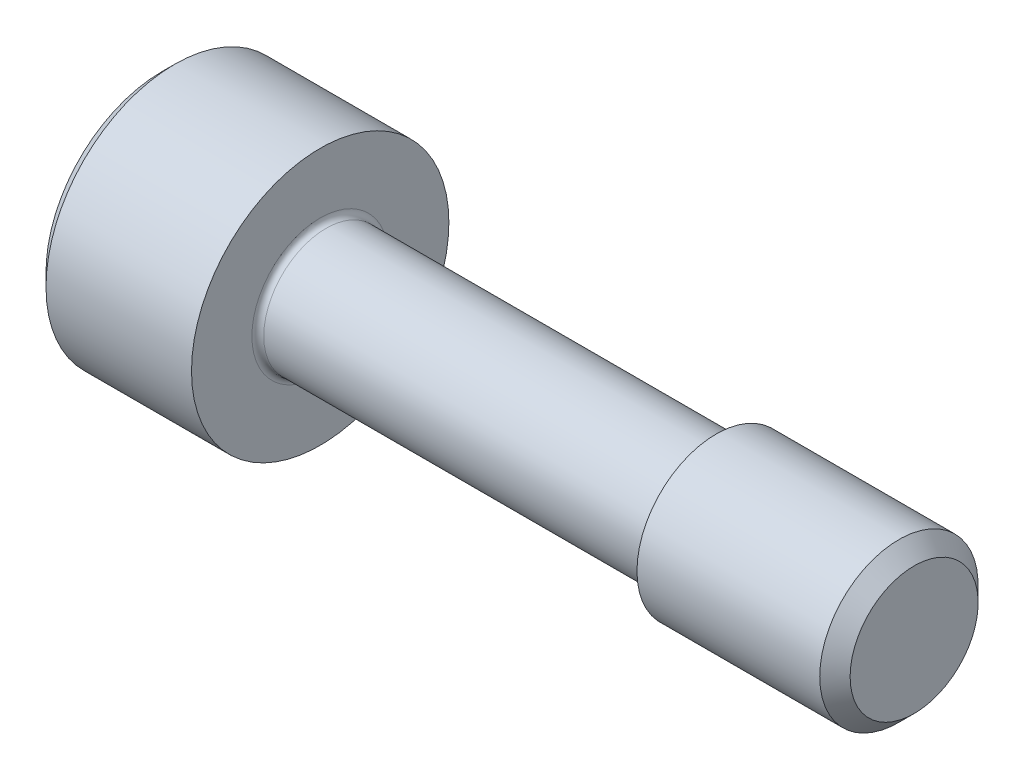
ISO-10303-21;
HEADER;
FILE_DESCRIPTION(('STEP AP214'),'2;1');
FILE_NAME('part.step','',(''),(''),'','','');
FILE_SCHEMA(('AUTOMOTIVE_DESIGN { 1 0 10303 214 1 1 1 1 }'));
ENDSEC;
DATA;
#1=APPLICATION_CONTEXT('core data for automotive mechanical design processes');
#2=APPLICATION_PROTOCOL_DEFINITION('international standard','automotive_design',2000,#1);
#3=PRODUCT_CONTEXT('',#1,'mechanical');
#4=PRODUCT('Part','Part','',(#3));
#5=PRODUCT_RELATED_PRODUCT_CATEGORY('part','',(#4));
#6=PRODUCT_DEFINITION_FORMATION('','',#4);
#7=PRODUCT_DEFINITION_CONTEXT('part definition',#1,'design');
#8=PRODUCT_DEFINITION('design','',#6,#7);
#9=PRODUCT_DEFINITION_SHAPE('','',#8);
#10=(LENGTH_UNIT() NAMED_UNIT(*) SI_UNIT(.MILLI.,.METRE.));
#11=(NAMED_UNIT(*) PLANE_ANGLE_UNIT() SI_UNIT($,.RADIAN.));
#12=(NAMED_UNIT(*) SI_UNIT($,.STERADIAN.) SOLID_ANGLE_UNIT());
#13=UNCERTAINTY_MEASURE_WITH_UNIT(LENGTH_MEASURE(1.E-05),#10,'distance_accuracy_value','');
#14=(GEOMETRIC_REPRESENTATION_CONTEXT(3) GLOBAL_UNCERTAINTY_ASSIGNED_CONTEXT((#13)) GLOBAL_UNIT_ASSIGNED_CONTEXT((#10,
#11,#12)) REPRESENTATION_CONTEXT('',''));
#15=CARTESIAN_POINT('',(0.,0.,0.));
#16=DIRECTION('',(0.,0.,1.));
#17=DIRECTION('',(1.,0.,0.));
#18=AXIS2_PLACEMENT_3D('',#15,#16,#17);
#19=CARTESIAN_POINT('',(-4.,0.,0.));
#20=DIRECTION('',(1.,0.,0.));
#21=DIRECTION('',(0.,0.,-1.));
#22=AXIS2_PLACEMENT_3D('',#19,#20,#21);
#23=PLANE('',#22);
#24=DIRECTION('',(0.,-0.500000000003371,-0.866025403782492));
#25=VECTOR('',#24,1.);
#26=CARTESIAN_POINT('',(-4.,-2.59807621134748,1.49999999999662));
#27=LINE('',#26,#25);
#28=CARTESIAN_POINT('',(-4.00000000000955,-2.59807621131968,1.49999999998057));
#29=VERTEX_POINT('',#28);
#30=CARTESIAN_POINT('',(-4.,-3.46410161513775,0.));
#31=VERTEX_POINT('',#30);
#32=EDGE_CURVE('E112',#29,#31,#27,.T.);
#33=ORIENTED_EDGE('',*,*,#32,.F.);
#34=CARTESIAN_POINT('',(-4.0000000000191,0.,0.));
#35=DIRECTION('',(-1.,0.,0.));
#36=DIRECTION('',(0.,0.,1.));
#37=AXIS2_PLACEMENT_3D('',#34,#35,#36);
#38=CIRCLE('',#37,2.99999999992906);
#39=CARTESIAN_POINT('',(-4.00000000000955,-2.59807621132258,-1.49999999998228));
#40=VERTEX_POINT('',#39);
#41=EDGE_CURVE('E115',#29,#40,#38,.F.);
#42=ORIENTED_EDGE('',*,*,#41,.T.);
#43=DIRECTION('',(0.,0.500000000000001,-0.866025403784438));
#44=VECTOR('',#43,1.);
#45=CARTESIAN_POINT('',(-4.,-3.46410161513775,0.));
#46=LINE('',#45,#44);
#47=EDGE_CURVE('E102',#31,#40,#46,.T.);
#48=ORIENTED_EDGE('',*,*,#47,.F.);
#49=EDGE_LOOP('',(#33,#42,#48));
#50=FACE_BOUND('',#49,.T.);
#51=ADVANCED_FACE('F17',(#50),#23,.F.);
#52=CARTESIAN_POINT('',(-4.,0.,0.));
#53=DIRECTION('',(1.,0.,0.));
#54=DIRECTION('',(0.,0.,-1.));
#55=AXIS2_PLACEMENT_3D('',#52,#53,#54);
#56=PLANE('',#55);
#57=DIRECTION('',(0.,0.499999999999999,-0.866025403784439));
#58=VECTOR('',#57,1.);
#59=CARTESIAN_POINT('',(-4.,-2.5980762113533,-1.50000000000001));
#60=LINE('',#59,#58);
#61=CARTESIAN_POINT('',(-4.,-1.73205080756887,-3.));
#62=VERTEX_POINT('',#61);
#63=EDGE_CURVE('E107',#40,#62,#60,.T.);
#64=ORIENTED_EDGE('',*,*,#63,.F.);
#65=CARTESIAN_POINT('',(-4.0000000000191,0.,0.));
#66=DIRECTION('',(-1.,0.,0.));
#67=DIRECTION('',(0.,0.,1.));
#68=AXIS2_PLACEMENT_3D('',#65,#66,#67);
#69=CIRCLE('',#68,2.99999999992906);
#70=CARTESIAN_POINT('',(-4.00000000000955,0.,-2.99999999996368));
#71=VERTEX_POINT('',#70);
#72=EDGE_CURVE('E120',#40,#71,#69,.F.);
#73=ORIENTED_EDGE('',*,*,#72,.T.);
#74=DIRECTION('',(0.,1.,0.));
#75=VECTOR('',#74,1.);
#76=CARTESIAN_POINT('',(-4.,0.,-3.));
#77=LINE('',#76,#75);
#78=EDGE_CURVE('E128',#62,#71,#77,.T.);
#79=ORIENTED_EDGE('',*,*,#78,.F.);
#80=EDGE_LOOP('',(#64,#73,#79));
#81=FACE_BOUND('',#80,.T.);
#82=ADVANCED_FACE('F126',(#81),#56,.F.);
#83=CARTESIAN_POINT('',(-4.,0.,0.));
#84=DIRECTION('',(1.,0.,0.));
#85=DIRECTION('',(0.,0.,-1.));
#86=AXIS2_PLACEMENT_3D('',#83,#84,#85);
#87=PLANE('',#86);
#88=DIRECTION('',(0.,1.,0.));
#89=VECTOR('',#88,1.);
#90=CARTESIAN_POINT('',(-4.,0.,2.99999999999831));
#91=LINE('',#90,#89);
#92=CARTESIAN_POINT('',(-4.00000000000955,0.,2.99999999996368));
#93=VERTEX_POINT('',#92);
#94=CARTESIAN_POINT('',(-4.00000000000033,-1.73205080756953,2.99999999999887));
#95=VERTEX_POINT('',#94);
#96=EDGE_CURVE('E317',#93,#95,#91,.F.);
#97=ORIENTED_EDGE('',*,*,#96,.F.);
#98=CARTESIAN_POINT('',(-4.0000000000191,0.,0.));
#99=DIRECTION('',(-1.,0.,0.));
#100=DIRECTION('',(0.,0.,1.));
#101=AXIS2_PLACEMENT_3D('',#98,#99,#100);
#102=CIRCLE('',#101,2.99999999992906);
#103=EDGE_CURVE('E135',#93,#29,#102,.F.);
#104=ORIENTED_EDGE('',*,*,#103,.T.);
#105=DIRECTION('',(0.,-0.499999999996627,-0.866025403786386));
#106=VECTOR('',#105,1.);
#107=CARTESIAN_POINT('',(-4.,-1.73205080756888,3.));
#108=LINE('',#107,#106);
#109=EDGE_CURVE('E96',#95,#29,#108,.T.);
#110=ORIENTED_EDGE('',*,*,#109,.F.);
#111=EDGE_LOOP('',(#97,#104,#110));
#112=FACE_BOUND('',#111,.T.);
#113=ADVANCED_FACE('F222',(#112),#87,.F.);
#114=CARTESIAN_POINT('',(-4.,0.,0.));
#115=DIRECTION('',(1.,0.,0.));
#116=DIRECTION('',(0.,0.,-1.));
#117=AXIS2_PLACEMENT_3D('',#114,#115,#116);
#118=PLANE('',#117);
#119=DIRECTION('',(0.,1.,0.));
#120=VECTOR('',#119,1.);
#121=CARTESIAN_POINT('',(-4.,0.,-2.99999999999831));
#122=LINE('',#121,#120);
#123=CARTESIAN_POINT('',(-4.,1.73205080756953,-2.99999999999887));
#124=VERTEX_POINT('',#123);
#125=EDGE_CURVE('E277',#71,#124,#122,.T.);
#126=ORIENTED_EDGE('',*,*,#125,.F.);
#127=CARTESIAN_POINT('',(-4.0000000000191,0.,0.));
#128=DIRECTION('',(-1.,0.,0.));
#129=DIRECTION('',(0.,0.,1.));
#130=AXIS2_PLACEMENT_3D('',#127,#128,#129);
#131=CIRCLE('',#130,2.99999999992906);
#132=CARTESIAN_POINT('',(-4.00000000000955,2.59807621131967,-1.49999999998059));
#133=VERTEX_POINT('',#132);
#134=EDGE_CURVE('E134',#71,#133,#131,.F.);
#135=ORIENTED_EDGE('',*,*,#134,.T.);
#136=DIRECTION('',(0.,0.499999999996627,0.866025403786386));
#137=VECTOR('',#136,1.);
#138=CARTESIAN_POINT('',(-4.,1.73205080756888,-3.));
#139=LINE('',#138,#137);
#140=EDGE_CURVE('E276',#124,#133,#139,.T.);
#141=ORIENTED_EDGE('',*,*,#140,.F.);
#142=EDGE_LOOP('',(#126,#135,#141));
#143=FACE_BOUND('',#142,.T.);
#144=ADVANCED_FACE('F218',(#143),#118,.F.);
#145=CARTESIAN_POINT('',(-4.,0.,0.));
#146=DIRECTION('',(1.,0.,0.));
#147=DIRECTION('',(0.,0.,-1.));
#148=AXIS2_PLACEMENT_3D('',#145,#146,#147);
#149=PLANE('',#148);
#150=DIRECTION('',(0.,0.500000000003371,0.866025403782493));
#151=VECTOR('',#150,1.);
#152=CARTESIAN_POINT('',(-4.,2.59807621134747,-1.49999999999664));
#153=LINE('',#152,#151);
#154=CARTESIAN_POINT('',(-4.,3.46410161513775,0.));
#155=VERTEX_POINT('',#154);
#156=EDGE_CURVE('E279',#133,#155,#153,.T.);
#157=ORIENTED_EDGE('',*,*,#156,.F.);
#158=CARTESIAN_POINT('',(-4.0000000000191,0.,0.));
#159=DIRECTION('',(-1.,0.,0.));
#160=DIRECTION('',(0.,0.,1.));
#161=AXIS2_PLACEMENT_3D('',#158,#159,#160);
#162=CIRCLE('',#161,2.99999999992906);
#163=CARTESIAN_POINT('',(-4.00000000000955,2.5980762113226,1.49999999998225));
#164=VERTEX_POINT('',#163);
#165=EDGE_CURVE('E272',#133,#164,#162,.F.);
#166=ORIENTED_EDGE('',*,*,#165,.T.);
#167=DIRECTION('',(0.,-0.5,0.866025403784439));
#168=VECTOR('',#167,1.);
#169=CARTESIAN_POINT('',(-4.,3.46410161513775,0.));
#170=LINE('',#169,#168);
#171=EDGE_CURVE('E121',#155,#164,#170,.T.);
#172=ORIENTED_EDGE('',*,*,#171,.F.);
#173=EDGE_LOOP('',(#157,#166,#172));
#174=FACE_BOUND('',#173,.T.);
#175=ADVANCED_FACE('F214',(#174),#149,.F.);
#176=CARTESIAN_POINT('',(-4.0000000000191,0.,0.));
#177=DIRECTION('',(-1.,0.,0.));
#178=DIRECTION('',(0.,0.,1.));
#179=AXIS2_PLACEMENT_3D('',#176,#177,#178);
#180=CONICAL_SURFACE('',#179,2.99999999992906,1.04719755118004);
#181=CARTESIAN_POINT('',(-2.26794919251461,0.,5.6843418860808E-11));
#182=VERTEX_POINT('',#181);
#183=VERTEX_LOOP('',#182);
#184=FACE_BOUND('',#183,.T.);
#185=ORIENTED_EDGE('',*,*,#103,.F.);
#186=CARTESIAN_POINT('',(-4.0000000000191,0.,0.));
#187=DIRECTION('',(-1.,0.,0.));
#188=DIRECTION('',(0.,0.,1.));
#189=AXIS2_PLACEMENT_3D('',#186,#187,#188);
#190=CIRCLE('',#189,2.99999999992906);
#191=EDGE_CURVE('E268',#93,#164,#190,.T.);
#192=ORIENTED_EDGE('',*,*,#191,.T.);
#193=ORIENTED_EDGE('',*,*,#165,.F.);
#194=ORIENTED_EDGE('',*,*,#134,.F.);
#195=ORIENTED_EDGE('',*,*,#72,.F.);
#196=ORIENTED_EDGE('',*,*,#41,.F.);
#197=EDGE_LOOP('',(#185,#192,#193,#194,#195,#196));
#198=FACE_BOUND('',#197,.T.);
#199=ADVANCED_FACE('F131',(#184,#198),#180,.F.);
#200=CARTESIAN_POINT('',(-4.,0.,0.));
#201=DIRECTION('',(1.,0.,0.));
#202=DIRECTION('',(0.,0.,-1.));
#203=AXIS2_PLACEMENT_3D('',#200,#201,#202);
#204=PLANE('',#203);
#205=DIRECTION('',(0.,0.5,-0.866025403784439));
#206=VECTOR('',#205,1.);
#207=CARTESIAN_POINT('',(-4.,3.46410161513775,0.));
#208=LINE('',#207,#206);
#209=CARTESIAN_POINT('',(-4.,1.73205080756887,3.));
#210=VERTEX_POINT('',#209);
#211=EDGE_CURVE('E287',#164,#210,#208,.F.);
#212=ORIENTED_EDGE('',*,*,#211,.F.);
#213=ORIENTED_EDGE('',*,*,#191,.F.);
#214=DIRECTION('',(0.,1.,0.));
#215=VECTOR('',#214,1.);
#216=CARTESIAN_POINT('',(-4.,1.73205080756888,3.));
#217=LINE('',#216,#215);
#218=EDGE_CURVE('E271',#210,#93,#217,.F.);
#219=ORIENTED_EDGE('',*,*,#218,.F.);
#220=EDGE_LOOP('',(#212,#213,#219));
#221=FACE_BOUND('',#220,.T.);
#222=ADVANCED_FACE('F207',(#221),#204,.F.);
#223=CARTESIAN_POINT('',(-4.,1.73205080756888,3.));
#224=DIRECTION('',(0.,0.,-1.));
#225=DIRECTION('',(-1.,0.,0.));
#226=AXIS2_PLACEMENT_3D('',#223,#224,#225);
#227=PLANE('',#226);
#228=DIRECTION('',(0.,1.,0.));
#229=VECTOR('',#228,1.);
#230=CARTESIAN_POINT('',(-8.,3.,3.));
#231=LINE('',#230,#229);
#232=CARTESIAN_POINT('',(-8.,-1.73205080756888,3.));
#233=VERTEX_POINT('',#232);
#234=CARTESIAN_POINT('',(-8.,1.73205080756888,3.));
#235=VERTEX_POINT('',#234);
#236=EDGE_CURVE('E297',#233,#235,#231,.T.);
#237=ORIENTED_EDGE('',*,*,#236,.T.);
#238=DIRECTION('',(1.,0.,0.));
#239=VECTOR('',#238,1.);
#240=CARTESIAN_POINT('',(-4.,1.73205080756887,3.));
#241=LINE('',#240,#239);
#242=EDGE_CURVE('E290',#210,#235,#241,.F.);
#243=ORIENTED_EDGE('',*,*,#242,.F.);
#244=ORIENTED_EDGE('',*,*,#218,.T.);
#245=ORIENTED_EDGE('',*,*,#96,.T.);
#246=DIRECTION('',(1.,0.,0.));
#247=VECTOR('',#246,1.);
#248=CARTESIAN_POINT('',(-4.,-1.73205080756888,3.));
#249=LINE('',#248,#247);
#250=EDGE_CURVE('E342',#233,#95,#249,.T.);
#251=ORIENTED_EDGE('',*,*,#250,.F.);
#252=EDGE_LOOP('',(#237,#243,#244,#245,#251));
#253=FACE_BOUND('',#252,.T.);
#254=ADVANCED_FACE('F203',(#253),#227,.T.);
#255=CARTESIAN_POINT('',(-4.,3.46410161513775,0.));
#256=DIRECTION('',(0.,-0.866025403784439,-0.5));
#257=DIRECTION('',(0.,0.5,-0.866025403784439));
#258=AXIS2_PLACEMENT_3D('',#255,#256,#257);
#259=PLANE('',#258);
#260=DIRECTION('',(0.,0.5,-0.866025403784438));
#261=VECTOR('',#260,1.);
#262=CARTESIAN_POINT('',(-8.,1.73205080756888,3.));
#263=LINE('',#262,#261);
#264=CARTESIAN_POINT('',(-8.,3.46410161513775,0.));
#265=VERTEX_POINT('',#264);
#266=EDGE_CURVE('E366',#235,#265,#263,.T.);
#267=ORIENTED_EDGE('',*,*,#266,.T.);
#268=DIRECTION('',(1.,0.,0.));
#269=VECTOR('',#268,1.);
#270=CARTESIAN_POINT('',(-4.,3.46410161513775,0.));
#271=LINE('',#270,#269);
#272=EDGE_CURVE('E292',#155,#265,#271,.F.);
#273=ORIENTED_EDGE('',*,*,#272,.F.);
#274=ORIENTED_EDGE('',*,*,#171,.T.);
#275=ORIENTED_EDGE('',*,*,#211,.T.);
#276=ORIENTED_EDGE('',*,*,#242,.T.);
#277=EDGE_LOOP('',(#267,#273,#274,#275,#276));
#278=FACE_BOUND('',#277,.T.);
#279=ADVANCED_FACE('F199',(#278),#259,.T.);
#280=CARTESIAN_POINT('',(-4.,1.73205080756888,-3.));
#281=DIRECTION('',(0.,-0.866025403784439,0.5));
#282=DIRECTION('',(0.,-0.5,-0.866025403784439));
#283=AXIS2_PLACEMENT_3D('',#280,#281,#282);
#284=PLANE('',#283);
#285=DIRECTION('',(0.,-0.500000000000001,-0.866025403784438));
#286=VECTOR('',#285,1.);
#287=CARTESIAN_POINT('',(-8.,3.46410161513776,0.));
#288=LINE('',#287,#286);
#289=CARTESIAN_POINT('',(-8.,1.73205080756888,-3.));
#290=VERTEX_POINT('',#289);
#291=EDGE_CURVE('E365',#265,#290,#288,.T.);
#292=ORIENTED_EDGE('',*,*,#291,.T.);
#293=DIRECTION('',(1.,0.,0.));
#294=VECTOR('',#293,1.);
#295=CARTESIAN_POINT('',(-4.,1.73205080756888,-3.));
#296=LINE('',#295,#294);
#297=EDGE_CURVE('E334',#124,#290,#296,.F.);
#298=ORIENTED_EDGE('',*,*,#297,.F.);
#299=ORIENTED_EDGE('',*,*,#140,.T.);
#300=ORIENTED_EDGE('',*,*,#156,.T.);
#301=ORIENTED_EDGE('',*,*,#272,.T.);
#302=EDGE_LOOP('',(#292,#298,#299,#300,#301));
#303=FACE_BOUND('',#302,.T.);
#304=ADVANCED_FACE('F195',(#303),#284,.T.);
#305=CARTESIAN_POINT('',(-4.,-1.73205080756888,-3.));
#306=DIRECTION('',(0.,0.,1.));
#307=DIRECTION('',(1.,0.,0.));
#308=AXIS2_PLACEMENT_3D('',#305,#306,#307);
#309=PLANE('',#308);
#310=DIRECTION('',(0.,1.,0.));
#311=VECTOR('',#310,1.);
#312=CARTESIAN_POINT('',(-8.,3.,-3.));
#313=LINE('',#312,#311);
#314=CARTESIAN_POINT('',(-8.,-1.73205080756888,-3.));
#315=VERTEX_POINT('',#314);
#316=EDGE_CURVE('E359',#290,#315,#313,.F.);
#317=ORIENTED_EDGE('',*,*,#316,.T.);
#318=DIRECTION('',(1.,0.,0.));
#319=VECTOR('',#318,1.);
#320=CARTESIAN_POINT('',(-4.,-1.73205080756887,-3.));
#321=LINE('',#320,#319);
#322=EDGE_CURVE('E339',#62,#315,#321,.F.);
#323=ORIENTED_EDGE('',*,*,#322,.F.);
#324=ORIENTED_EDGE('',*,*,#78,.T.);
#325=ORIENTED_EDGE('',*,*,#125,.T.);
#326=ORIENTED_EDGE('',*,*,#297,.T.);
#327=EDGE_LOOP('',(#317,#323,#324,#325,#326));
#328=FACE_BOUND('',#327,.T.);
#329=ADVANCED_FACE('F192',(#328),#309,.T.);
#330=CARTESIAN_POINT('',(-4.,-3.46410161513775,0.));
#331=DIRECTION('',(0.,0.866025403784439,0.5));
#332=DIRECTION('',(0.,-0.5,0.866025403784439));
#333=AXIS2_PLACEMENT_3D('',#330,#331,#332);
#334=PLANE('',#333);
#335=DIRECTION('',(0.,-0.499999999999998,0.86602540378444));
#336=VECTOR('',#335,1.);
#337=CARTESIAN_POINT('',(-8.,-1.73205080756888,-3.));
#338=LINE('',#337,#336);
#339=CARTESIAN_POINT('',(-8.,-3.46410161513775,0.));
#340=VERTEX_POINT('',#339);
#341=EDGE_CURVE('E356',#315,#340,#338,.T.);
#342=ORIENTED_EDGE('',*,*,#341,.T.);
#343=DIRECTION('',(1.,0.,0.));
#344=VECTOR('',#343,1.);
#345=CARTESIAN_POINT('',(-4.,-3.46410161513775,0.));
#346=LINE('',#345,#344);
#347=EDGE_CURVE('E110',#31,#340,#346,.F.);
#348=ORIENTED_EDGE('',*,*,#347,.F.);
#349=ORIENTED_EDGE('',*,*,#47,.T.);
#350=ORIENTED_EDGE('',*,*,#63,.T.);
#351=ORIENTED_EDGE('',*,*,#322,.T.);
#352=EDGE_LOOP('',(#342,#348,#349,#350,#351));
#353=FACE_BOUND('',#352,.T.);
#354=ADVANCED_FACE('F104',(#353),#334,.T.);
#355=CARTESIAN_POINT('',(-4.,-1.73205080756888,3.));
#356=DIRECTION('',(0.,0.866025403784439,-0.5));
#357=DIRECTION('',(0.,0.5,0.866025403784439));
#358=AXIS2_PLACEMENT_3D('',#355,#356,#357);
#359=PLANE('',#358);
#360=DIRECTION('',(0.,0.499999999999999,0.866025403784439));
#361=VECTOR('',#360,1.);
#362=CARTESIAN_POINT('',(-8.,-3.46410161513775,0.));
#363=LINE('',#362,#361);
#364=EDGE_CURVE('E267',#340,#233,#363,.T.);
#365=ORIENTED_EDGE('',*,*,#364,.T.);
#366=ORIENTED_EDGE('',*,*,#250,.T.);
#367=ORIENTED_EDGE('',*,*,#109,.T.);
#368=ORIENTED_EDGE('',*,*,#32,.T.);
#369=ORIENTED_EDGE('',*,*,#347,.T.);
#370=EDGE_LOOP('',(#365,#366,#367,#368,#369));
#371=FACE_BOUND('',#370,.T.);
#372=ADVANCED_FACE('F186',(#371),#359,.T.);
#373=CARTESIAN_POINT('',(-8.,3.,0.));
#374=DIRECTION('',(1.,0.,0.));
#375=DIRECTION('',(0.,0.,-1.));
#376=AXIS2_PLACEMENT_3D('',#373,#374,#375);
#377=PLANE('',#376);
#378=ORIENTED_EDGE('',*,*,#341,.F.);
#379=ORIENTED_EDGE('',*,*,#316,.F.);
#380=ORIENTED_EDGE('',*,*,#291,.F.);
#381=ORIENTED_EDGE('',*,*,#266,.F.);
#382=ORIENTED_EDGE('',*,*,#236,.F.);
#383=ORIENTED_EDGE('',*,*,#364,.F.);
#384=EDGE_LOOP('',(#378,#379,#380,#381,#382,#383));
#385=FACE_BOUND('',#384,.T.);
#386=CARTESIAN_POINT('',(-7.99999999992451,0.,0.));
#387=DIRECTION('',(1.,0.,0.));
#388=DIRECTION('',(0.,1.,0.));
#389=AXIS2_PLACEMENT_3D('',#386,#387,#388);
#390=CIRCLE('',#389,5.85000000000946);
#391=CARTESIAN_POINT('',(-7.99999999992451,5.85000000000946,0.));
#392=VERTEX_POINT('',#391);
#393=EDGE_CURVE('E264',#392,#392,#390,.T.);
#394=ORIENTED_EDGE('',*,*,#393,.F.);
#395=EDGE_LOOP('',(#394));
#396=FACE_BOUND('',#395,.T.);
#397=ADVANCED_FACE('F182',(#385,#396),#377,.F.);
#398=CARTESIAN_POINT('',(-7.34999999991715,0.,0.));
#399=DIRECTION('',(1.,0.,0.));
#400=DIRECTION('',(0.,1.,0.));
#401=AXIS2_PLACEMENT_3D('',#398,#399,#400);
#402=CONICAL_SURFACE('',#401,6.50000000001683,0.785398163397448);
#403=ORIENTED_EDGE('',*,*,#393,.T.);
#404=EDGE_LOOP('',(#403));
#405=FACE_BOUND('',#404,.T.);
#406=CARTESIAN_POINT('',(-7.35,0.,0.));
#407=DIRECTION('',(-1.,0.,0.));
#408=DIRECTION('',(0.,0.,1.));
#409=AXIS2_PLACEMENT_3D('',#406,#407,#408);
#410=CIRCLE('',#409,6.5);
#411=CARTESIAN_POINT('',(-7.35,0.,6.5));
#412=VERTEX_POINT('',#411);
#413=EDGE_CURVE('E263',#412,#412,#410,.F.);
#414=ORIENTED_EDGE('',*,*,#413,.F.);
#415=EDGE_LOOP('',(#414));
#416=FACE_BOUND('',#415,.T.);
#417=ADVANCED_FACE('F178',(#405,#416),#402,.T.);
#418=CARTESIAN_POINT('',(30.,3.233,0.));
#419=DIRECTION('',(-1.,0.,0.));
#420=DIRECTION('',(0.,0.,1.));
#421=AXIS2_PLACEMENT_3D('',#418,#419,#420);
#422=PLANE('',#421);
#423=CARTESIAN_POINT('',(30.0000000000296,0.,0.));
#424=DIRECTION('',(-1.,0.,0.));
#425=DIRECTION('',(0.,0.,1.));
#426=AXIS2_PLACEMENT_3D('',#423,#424,#425);
#427=CIRCLE('',#426,3.23300000002291);
#428=CARTESIAN_POINT('',(30.0000000000296,0.,3.23300000002291));
#429=VERTEX_POINT('',#428);
#430=EDGE_CURVE('E260',#429,#429,#427,.T.);
#431=ORIENTED_EDGE('',*,*,#430,.F.);
#432=EDGE_LOOP('',(#431));
#433=FACE_BOUND('',#432,.T.);
#434=ADVANCED_FACE('F174',(#433),#422,.F.);
#435=CARTESIAN_POINT('',(30.,0.,0.));
#436=DIRECTION('',(-1.,0.,0.));
#437=DIRECTION('',(0.,0.,1.));
#438=AXIS2_PLACEMENT_3D('',#435,#436,#437);
#439=CYLINDRICAL_SURFACE('',#438,6.5);
#440=ORIENTED_EDGE('',*,*,#413,.T.);
#441=EDGE_LOOP('',(#440));
#442=FACE_BOUND('',#441,.T.);
#443=CARTESIAN_POINT('',(0.,0.,0.));
#444=DIRECTION('',(-1.,0.,0.));
#445=DIRECTION('',(0.,0.,1.));
#446=AXIS2_PLACEMENT_3D('',#443,#444,#445);
#447=CIRCLE('',#446,6.5);
#448=CARTESIAN_POINT('',(0.,0.,6.5));
#449=VERTEX_POINT('',#448);
#450=EDGE_CURVE('E257',#449,#449,#447,.T.);
#451=ORIENTED_EDGE('',*,*,#450,.T.);
#452=EDGE_LOOP('',(#451));
#453=FACE_BOUND('',#452,.T.);
#454=ADVANCED_FACE('F170',(#442,#453),#439,.T.);
#455=CARTESIAN_POINT('',(29.2330000001471,0.,0.));
#456=DIRECTION('',(-1.,0.,0.));
#457=DIRECTION('',(0.,0.,1.));
#458=AXIS2_PLACEMENT_3D('',#455,#456,#457);
#459=CONICAL_SURFACE('',#458,3.99999999996226,0.785398163434504);
#460=ORIENTED_EDGE('',*,*,#430,.T.);
#461=EDGE_LOOP('',(#460));
#462=FACE_BOUND('',#461,.T.);
#463=CARTESIAN_POINT('',(29.233,0.,0.));
#464=DIRECTION('',(-1.,0.,0.));
#465=DIRECTION('',(0.,0.,1.));
#466=AXIS2_PLACEMENT_3D('',#463,#464,#465);
#467=CIRCLE('',#466,4.);
#468=CARTESIAN_POINT('',(29.233,0.,4.));
#469=VERTEX_POINT('',#468);
#470=EDGE_CURVE('E143',#469,#469,#467,.T.);
#471=ORIENTED_EDGE('',*,*,#470,.F.);
#472=EDGE_LOOP('',(#471));
#473=FACE_BOUND('',#472,.T.);
#474=ADVANCED_FACE('F166',(#462,#473),#459,.T.);
#475=CARTESIAN_POINT('',(0.,6.5,0.));
#476=DIRECTION('',(-1.,0.,0.));
#477=DIRECTION('',(0.,0.,1.));
#478=AXIS2_PLACEMENT_3D('',#475,#476,#477);
#479=PLANE('',#478);
#480=CARTESIAN_POINT('',(0.,0.,0.));
#481=DIRECTION('',(1.,0.,0.));
#482=DIRECTION('',(0.,0.,-1.));
#483=AXIS2_PLACEMENT_3D('',#480,#481,#482);
#484=CIRCLE('',#483,3.45);
#485=CARTESIAN_POINT('',(0.,0.,3.45));
#486=VERTEX_POINT('',#485);
#487=CARTESIAN_POINT('',(0.,0.,-3.45));
#488=VERTEX_POINT('',#487);
#489=EDGE_CURVE('E36',#486,#488,#484,.F.);
#490=ORIENTED_EDGE('',*,*,#489,.T.);
#491=CARTESIAN_POINT('',(0.,0.,0.));
#492=DIRECTION('',(1.,0.,0.));
#493=DIRECTION('',(0.,0.,1.));
#494=AXIS2_PLACEMENT_3D('',#491,#492,#493);
#495=CIRCLE('',#494,3.45);
#496=EDGE_CURVE('E141',#488,#486,#495,.F.);
#497=ORIENTED_EDGE('',*,*,#496,.T.);
#498=EDGE_LOOP('',(#490,#497));
#499=FACE_BOUND('',#498,.T.);
#500=ORIENTED_EDGE('',*,*,#450,.F.);
#501=EDGE_LOOP('',(#500));
#502=FACE_BOUND('',#501,.T.);
#503=ADVANCED_FACE('F145',(#499,#502),#479,.F.);
#504=CARTESIAN_POINT('',(30.,0.,0.));
#505=DIRECTION('',(-1.,0.,0.));
#506=DIRECTION('',(0.,0.,1.));
#507=AXIS2_PLACEMENT_3D('',#504,#505,#506);
#508=CYLINDRICAL_SURFACE('',#507,4.);
#509=ORIENTED_EDGE('',*,*,#470,.T.);
#510=EDGE_LOOP('',(#509));
#511=FACE_BOUND('',#510,.T.);
#512=CARTESIAN_POINT('',(20.,0.,0.));
#513=DIRECTION('',(-1.,0.,0.));
#514=DIRECTION('',(0.,0.,1.));
#515=AXIS2_PLACEMENT_3D('',#512,#513,#514);
#516=CIRCLE('',#515,4.);
#517=CARTESIAN_POINT('',(20.,0.,4.));
#518=VERTEX_POINT('',#517);
#519=EDGE_CURVE('E147',#518,#518,#516,.F.);
#520=ORIENTED_EDGE('',*,*,#519,.T.);
#521=EDGE_LOOP('',(#520));
#522=FACE_BOUND('',#521,.T.);
#523=ADVANCED_FACE('F165',(#511,#522),#508,.T.);
#524=CARTESIAN_POINT('',(0.299999999999999,0.,0.));
#525=DIRECTION('',(1.,0.,0.));
#526=DIRECTION('',(0.,0.,-1.));
#527=AXIS2_PLACEMENT_3D('',#524,#525,#526);
#528=TOROIDAL_SURFACE('',#527,3.45,0.299999999999999);
#529=CARTESIAN_POINT('',(0.299999999999998,0.,0.));
#530=DIRECTION('',(-1.,0.,0.));
#531=DIRECTION('',(0.,0.,1.));
#532=AXIS2_PLACEMENT_3D('',#529,#530,#531);
#533=CIRCLE('',#532,3.15);
#534=CARTESIAN_POINT('',(0.299999999999998,0.,3.15));
#535=VERTEX_POINT('',#534);
#536=EDGE_CURVE('E28',#535,#535,#533,.F.);
#537=ORIENTED_EDGE('',*,*,#536,.F.);
#538=EDGE_LOOP('',(#537));
#539=FACE_BOUND('',#538,.T.);
#540=ORIENTED_EDGE('',*,*,#496,.F.);
#541=ORIENTED_EDGE('',*,*,#489,.F.);
#542=EDGE_LOOP('',(#540,#541));
#543=FACE_BOUND('',#542,.T.);
#544=ADVANCED_FACE('F140',(#539,#543),#528,.F.);
#545=CARTESIAN_POINT('',(20.,3.15,0.));
#546=DIRECTION('',(1.,0.,0.));
#547=DIRECTION('',(0.,0.,-1.));
#548=AXIS2_PLACEMENT_3D('',#545,#546,#547);
#549=PLANE('',#548);
#550=CARTESIAN_POINT('',(20.,0.,0.));
#551=DIRECTION('',(-1.,0.,0.));
#552=DIRECTION('',(0.,0.,1.));
#553=AXIS2_PLACEMENT_3D('',#550,#551,#552);
#554=CIRCLE('',#553,3.15);
#555=CARTESIAN_POINT('',(20.,0.,3.15));
#556=VERTEX_POINT('',#555);
#557=EDGE_CURVE('E11',#556,#556,#554,.T.);
#558=ORIENTED_EDGE('',*,*,#557,.F.);
#559=EDGE_LOOP('',(#558));
#560=FACE_BOUND('',#559,.T.);
#561=ORIENTED_EDGE('',*,*,#519,.F.);
#562=EDGE_LOOP('',(#561));
#563=FACE_BOUND('',#562,.T.);
#564=ADVANCED_FACE('F233',(#560,#563),#549,.F.);
#565=CARTESIAN_POINT('',(30.,0.,0.));
#566=DIRECTION('',(-1.,0.,0.));
#567=DIRECTION('',(0.,0.,1.));
#568=AXIS2_PLACEMENT_3D('',#565,#566,#567);
#569=CYLINDRICAL_SURFACE('',#568,3.15);
#570=ORIENTED_EDGE('',*,*,#557,.T.);
#571=EDGE_LOOP('',(#570));
#572=FACE_BOUND('',#571,.T.);
#573=ORIENTED_EDGE('',*,*,#536,.T.);
#574=EDGE_LOOP('',(#573));
#575=FACE_BOUND('',#574,.T.);
#576=ADVANCED_FACE('F231',(#572,#575),#569,.T.);
#577=CLOSED_SHELL('',(#51,#82,#113,#144,#175,#199,#222,#254,#279,#304,#329,#354,#372,#397,#417,
#434,#454,#474,#503,#523,#544,#564,#576));
#578=MANIFOLD_SOLID_BREP('B1',#577);
#579=ADVANCED_BREP_SHAPE_REPRESENTATION('',(#18,#578),#14);
#580=SHAPE_DEFINITION_REPRESENTATION(#9,#579);
ENDSEC;
END-ISO-10303-21;
